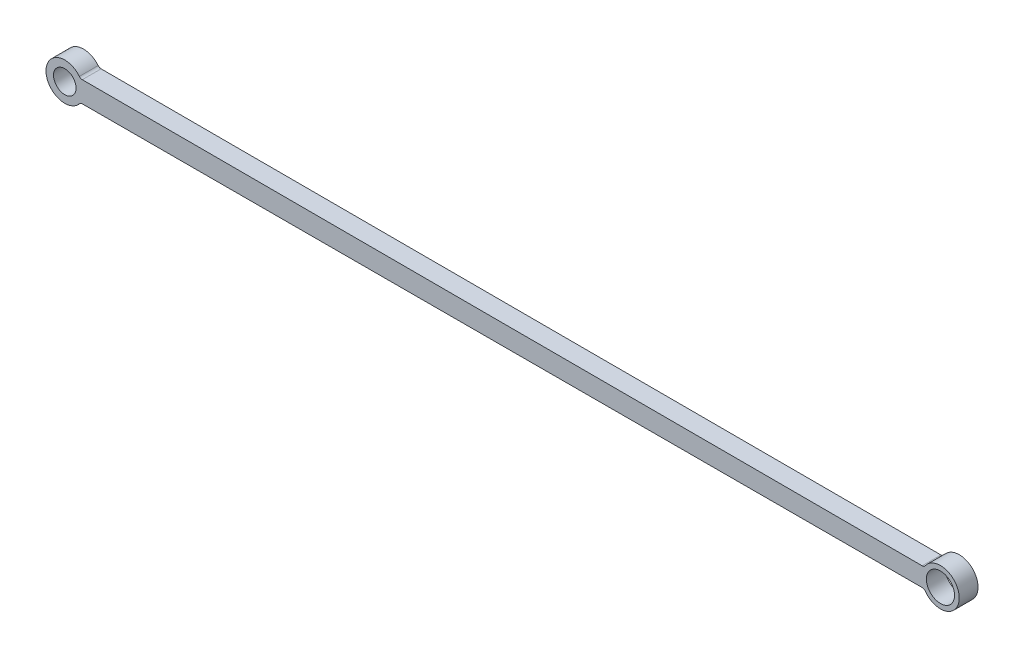
ISO-10303-21;
HEADER;
FILE_DESCRIPTION(('STEP AP214'),'2;1');
FILE_NAME('part.step','',(''),(''),'','','');
FILE_SCHEMA(('AUTOMOTIVE_DESIGN { 1 0 10303 214 1 1 1 1 }'));
ENDSEC;
DATA;
#1=APPLICATION_CONTEXT('core data for automotive mechanical design processes');
#2=APPLICATION_PROTOCOL_DEFINITION('international standard','automotive_design',2000,#1);
#3=PRODUCT_CONTEXT('',#1,'mechanical');
#4=PRODUCT('Part','Part','',(#3));
#5=PRODUCT_RELATED_PRODUCT_CATEGORY('part','',(#4));
#6=PRODUCT_DEFINITION_FORMATION('','',#4);
#7=PRODUCT_DEFINITION_CONTEXT('part definition',#1,'design');
#8=PRODUCT_DEFINITION('design','',#6,#7);
#9=PRODUCT_DEFINITION_SHAPE('','',#8);
#10=(LENGTH_UNIT() NAMED_UNIT(*) SI_UNIT(.MILLI.,.METRE.));
#11=(NAMED_UNIT(*) PLANE_ANGLE_UNIT() SI_UNIT($,.RADIAN.));
#12=(NAMED_UNIT(*) SI_UNIT($,.STERADIAN.) SOLID_ANGLE_UNIT());
#13=UNCERTAINTY_MEASURE_WITH_UNIT(LENGTH_MEASURE(1.E-05),#10,'distance_accuracy_value','');
#14=(GEOMETRIC_REPRESENTATION_CONTEXT(3) GLOBAL_UNCERTAINTY_ASSIGNED_CONTEXT((#13)) GLOBAL_UNIT_ASSIGNED_CONTEXT((#10,
#11,#12)) REPRESENTATION_CONTEXT('',''));
#15=CARTESIAN_POINT('',(0.,0.,0.));
#16=DIRECTION('',(0.,0.,1.));
#17=DIRECTION('',(1.,0.,0.));
#18=AXIS2_PLACEMENT_3D('',#15,#16,#17);
#19=CARTESIAN_POINT('',(4.65604427137213,3.78434297375684,5.));
#20=DIRECTION('',(0.,0.,-1.));
#21=DIRECTION('',(-1.,0.,0.));
#22=AXIS2_PLACEMENT_3D('',#19,#20,#21);
#23=PLANE('',#22);
#24=CARTESIAN_POINT('',(4.65604427137213,3.78434297375684,5.));
#25=DIRECTION('',(0.,0.,-1.));
#26=DIRECTION('',(-1.,0.,0.));
#27=AXIS2_PLACEMENT_3D('',#24,#25,#26);
#28=CIRCLE('',#27,1.);
#29=CARTESIAN_POINT('',(4.65479182801302,2.78434375806433,5.));
#30=VERTEX_POINT('',#29);
#31=CARTESIAN_POINT('',(3.88003689281011,3.15361914479737,5.));
#32=VERTEX_POINT('',#31);
#33=EDGE_CURVE('E144',#30,#32,#28,.T.);
#34=ORIENTED_EDGE('',*,*,#33,.T.);
#35=CARTESIAN_POINT('',(0.,0.,5.));
#36=DIRECTION('',(0.,0.,1.));
#37=DIRECTION('',(1.,0.,0.));
#38=AXIS2_PLACEMENT_3D('',#35,#36,#37);
#39=CIRCLE('',#38,5.);
#40=CARTESIAN_POINT('',(3.88003689281011,-3.15361914479737,5.));
#41=VERTEX_POINT('',#40);
#42=EDGE_CURVE('E92',#32,#41,#39,.T.);
#43=ORIENTED_EDGE('',*,*,#42,.T.);
#44=CARTESIAN_POINT('',(4.65604427137213,-3.78434297375684,5.));
#45=DIRECTION('',(0.,0.,-1.));
#46=DIRECTION('',(1.,0.,0.));
#47=AXIS2_PLACEMENT_3D('',#44,#45,#46);
#48=CIRCLE('',#47,1.);
#49=CARTESIAN_POINT('',(4.65479182801302,-2.78434375806433,5.));
#50=VERTEX_POINT('',#49);
#51=EDGE_CURVE('E159',#41,#50,#48,.T.);
#52=ORIENTED_EDGE('',*,*,#51,.T.);
#53=DIRECTION('',(0.999999215692508,0.00125244335911376,0.));
#54=VECTOR('',#53,1.);
#55=CARTESIAN_POINT('',(4.65479182801302,-2.78434375806433,5.));
#56=LINE('',#55,#54);
#57=CARTESIAN_POINT('',(228.128552645631,-2.50445531087353,5.));
#58=VERTEX_POINT('',#57);
#59=EDGE_CURVE('E172',#50,#58,#56,.T.);
#60=ORIENTED_EDGE('',*,*,#59,.T.);
#61=CARTESIAN_POINT('',(228.12980508899,-3.50445452656603,5.));
#62=DIRECTION('',(0.,0.,-1.));
#63=DIRECTION('',(1.,0.,0.));
#64=AXIS2_PLACEMENT_3D('',#61,#62,#63);
#65=CIRCLE('',#64,0.999999999999995);
#66=CARTESIAN_POINT('',(228.941504240825,-2.92037877213836,5.));
#67=VERTEX_POINT('',#66);
#68=EDGE_CURVE('E111',#58,#67,#65,.T.);
#69=ORIENTED_EDGE('',*,*,#68,.T.);
#70=CARTESIAN_POINT('',(233.,0.,5.));
#71=DIRECTION('',(0.,0.,1.));
#72=DIRECTION('',(1.,0.,0.));
#73=AXIS2_PLACEMENT_3D('',#70,#71,#72);
#74=CIRCLE('',#73,5.00000000000001);
#75=CARTESIAN_POINT('',(228.941504240825,2.92037877213836,5.));
#76=VERTEX_POINT('',#75);
#77=EDGE_CURVE('E105',#67,#76,#74,.T.);
#78=ORIENTED_EDGE('',*,*,#77,.T.);
#79=CARTESIAN_POINT('',(228.12980508899,3.50445452656603,5.));
#80=DIRECTION('',(0.,0.,-1.));
#81=DIRECTION('',(1.,0.,0.));
#82=AXIS2_PLACEMENT_3D('',#79,#80,#81);
#83=CIRCLE('',#82,0.999999999999995);
#84=CARTESIAN_POINT('',(228.128552645631,2.50445531087352,5.));
#85=VERTEX_POINT('',#84);
#86=EDGE_CURVE('E109',#76,#85,#83,.T.);
#87=ORIENTED_EDGE('',*,*,#86,.T.);
#88=DIRECTION('',(-0.999999215692508,0.00125244335911376,0.));
#89=VECTOR('',#88,1.);
#90=CARTESIAN_POINT('',(4.65479182801302,2.78434375806433,5.));
#91=LINE('',#90,#89);
#92=EDGE_CURVE('E49',#85,#30,#91,.T.);
#93=ORIENTED_EDGE('',*,*,#92,.T.);
#94=EDGE_LOOP('',(#34,#43,#52,#60,#69,#78,#87,#93));
#95=FACE_BOUND('',#94,.T.);
#96=CARTESIAN_POINT('',(0.,0.,5.));
#97=DIRECTION('',(0.,0.,1.));
#98=DIRECTION('',(1.,0.,0.));
#99=AXIS2_PLACEMENT_3D('',#96,#97,#98);
#100=CIRCLE('',#99,3.);
#101=CARTESIAN_POINT('',(3.,0.,5.));
#102=VERTEX_POINT('',#101);
#103=EDGE_CURVE('E133',#102,#102,#100,.T.);
#104=ORIENTED_EDGE('',*,*,#103,.F.);
#105=EDGE_LOOP('',(#104));
#106=FACE_BOUND('',#105,.T.);
#107=CARTESIAN_POINT('',(233.,0.,5.));
#108=DIRECTION('',(0.,0.,1.));
#109=DIRECTION('',(1.,0.,0.));
#110=AXIS2_PLACEMENT_3D('',#107,#108,#109);
#111=CIRCLE('',#110,3.75000000000001);
#112=CARTESIAN_POINT('',(236.75,0.,5.));
#113=VERTEX_POINT('',#112);
#114=EDGE_CURVE('E181',#113,#113,#111,.T.);
#115=ORIENTED_EDGE('',*,*,#114,.F.);
#116=EDGE_LOOP('',(#115));
#117=FACE_BOUND('',#116,.T.);
#118=ADVANCED_FACE('F32',(#95,#106,#117),#23,.F.);
#119=CARTESIAN_POINT('',(4.65604427137213,3.78434297375684,0.));
#120=DIRECTION('',(0.,0.,-1.));
#121=DIRECTION('',(-1.,0.,0.));
#122=AXIS2_PLACEMENT_3D('',#119,#120,#121);
#123=PLANE('',#122);
#124=CARTESIAN_POINT('',(0.,0.,0.));
#125=DIRECTION('',(0.,0.,1.));
#126=DIRECTION('',(1.,0.,0.));
#127=AXIS2_PLACEMENT_3D('',#124,#125,#126);
#128=CIRCLE('',#127,3.);
#129=CARTESIAN_POINT('',(3.,0.,0.));
#130=VERTEX_POINT('',#129);
#131=EDGE_CURVE('E178',#130,#130,#128,.T.);
#132=ORIENTED_EDGE('',*,*,#131,.T.);
#133=EDGE_LOOP('',(#132));
#134=FACE_BOUND('',#133,.T.);
#135=CARTESIAN_POINT('',(4.65604427137213,3.78434297375684,0.));
#136=DIRECTION('',(0.,0.,-1.));
#137=DIRECTION('',(-1.,0.,0.));
#138=AXIS2_PLACEMENT_3D('',#135,#136,#137);
#139=CIRCLE('',#138,1.);
#140=CARTESIAN_POINT('',(4.65479182801302,2.78434375806433,0.));
#141=VERTEX_POINT('',#140);
#142=CARTESIAN_POINT('',(3.88003689281011,3.15361914479737,0.));
#143=VERTEX_POINT('',#142);
#144=EDGE_CURVE('E129',#141,#143,#139,.T.);
#145=ORIENTED_EDGE('',*,*,#144,.F.);
#146=DIRECTION('',(-0.999999215692508,0.00125244335911376,0.));
#147=VECTOR('',#146,1.);
#148=CARTESIAN_POINT('',(4.65479182801302,2.78434375806433,0.));
#149=LINE('',#148,#147);
#150=CARTESIAN_POINT('',(228.128552645631,2.50445531087352,0.));
#151=VERTEX_POINT('',#150);
#152=EDGE_CURVE('E84',#151,#141,#149,.T.);
#153=ORIENTED_EDGE('',*,*,#152,.F.);
#154=CARTESIAN_POINT('',(228.12980508899,3.50445452656603,0.));
#155=DIRECTION('',(0.,0.,-1.));
#156=DIRECTION('',(1.,0.,0.));
#157=AXIS2_PLACEMENT_3D('',#154,#155,#156);
#158=CIRCLE('',#157,0.999999999999995);
#159=CARTESIAN_POINT('',(228.941504240825,2.92037877213836,0.));
#160=VERTEX_POINT('',#159);
#161=EDGE_CURVE('E78',#160,#151,#158,.T.);
#162=ORIENTED_EDGE('',*,*,#161,.F.);
#163=CARTESIAN_POINT('',(233.,0.,0.));
#164=DIRECTION('',(0.,0.,1.));
#165=DIRECTION('',(1.,0.,0.));
#166=AXIS2_PLACEMENT_3D('',#163,#164,#165);
#167=CIRCLE('',#166,5.00000000000001);
#168=CARTESIAN_POINT('',(228.941504240825,-2.92037877213836,0.));
#169=VERTEX_POINT('',#168);
#170=EDGE_CURVE('E119',#169,#160,#167,.T.);
#171=ORIENTED_EDGE('',*,*,#170,.F.);
#172=CARTESIAN_POINT('',(228.12980508899,-3.50445452656603,0.));
#173=DIRECTION('',(0.,0.,-1.));
#174=DIRECTION('',(1.,0.,0.));
#175=AXIS2_PLACEMENT_3D('',#172,#173,#174);
#176=CIRCLE('',#175,0.999999999999995);
#177=CARTESIAN_POINT('',(228.128552645631,-2.50445531087353,0.));
#178=VERTEX_POINT('',#177);
#179=EDGE_CURVE('E139',#178,#169,#176,.T.);
#180=ORIENTED_EDGE('',*,*,#179,.F.);
#181=DIRECTION('',(0.999999215692508,0.00125244335911376,0.));
#182=VECTOR('',#181,1.);
#183=CARTESIAN_POINT('',(4.65479182801302,-2.78434375806433,0.));
#184=LINE('',#183,#182);
#185=CARTESIAN_POINT('',(4.65479182801302,-2.78434375806433,0.));
#186=VERTEX_POINT('',#185);
#187=EDGE_CURVE('E137',#186,#178,#184,.T.);
#188=ORIENTED_EDGE('',*,*,#187,.F.);
#189=CARTESIAN_POINT('',(4.65604427137213,-3.78434297375684,0.));
#190=DIRECTION('',(0.,0.,-1.));
#191=DIRECTION('',(1.,0.,0.));
#192=AXIS2_PLACEMENT_3D('',#189,#190,#191);
#193=CIRCLE('',#192,1.);
#194=CARTESIAN_POINT('',(3.88003689281011,-3.15361914479737,0.));
#195=VERTEX_POINT('',#194);
#196=EDGE_CURVE('E135',#195,#186,#193,.T.);
#197=ORIENTED_EDGE('',*,*,#196,.F.);
#198=CARTESIAN_POINT('',(0.,0.,0.));
#199=DIRECTION('',(0.,0.,1.));
#200=DIRECTION('',(1.,0.,0.));
#201=AXIS2_PLACEMENT_3D('',#198,#199,#200);
#202=CIRCLE('',#201,5.);
#203=EDGE_CURVE('E132',#143,#195,#202,.T.);
#204=ORIENTED_EDGE('',*,*,#203,.F.);
#205=EDGE_LOOP('',(#145,#153,#162,#171,#180,#188,#197,#204));
#206=FACE_BOUND('',#205,.T.);
#207=CARTESIAN_POINT('',(233.,0.,0.));
#208=DIRECTION('',(0.,0.,1.));
#209=DIRECTION('',(1.,0.,0.));
#210=AXIS2_PLACEMENT_3D('',#207,#208,#209);
#211=CIRCLE('',#210,3.75000000000001);
#212=CARTESIAN_POINT('',(236.75,0.,0.));
#213=VERTEX_POINT('',#212);
#214=EDGE_CURVE('E184',#213,#213,#211,.T.);
#215=ORIENTED_EDGE('',*,*,#214,.T.);
#216=EDGE_LOOP('',(#215));
#217=FACE_BOUND('',#216,.T.);
#218=ADVANCED_FACE('F163',(#134,#206,#217),#123,.T.);
#219=CARTESIAN_POINT('',(4.65604427137213,3.78434297375684,5.));
#220=DIRECTION('',(0.,0.,-1.));
#221=DIRECTION('',(-1.,0.,0.));
#222=AXIS2_PLACEMENT_3D('',#219,#220,#221);
#223=CYLINDRICAL_SURFACE('',#222,1.);
#224=ORIENTED_EDGE('',*,*,#144,.T.);
#225=DIRECTION('',(0.,0.,-1.));
#226=VECTOR('',#225,1.);
#227=CARTESIAN_POINT('',(3.88003689281011,3.15361914479737,5.));
#228=LINE('',#227,#226);
#229=EDGE_CURVE('E11',#32,#143,#228,.T.);
#230=ORIENTED_EDGE('',*,*,#229,.F.);
#231=ORIENTED_EDGE('',*,*,#33,.F.);
#232=DIRECTION('',(0.,0.,-1.));
#233=VECTOR('',#232,1.);
#234=CARTESIAN_POINT('',(4.65479182801302,2.78434375806433,5.));
#235=LINE('',#234,#233);
#236=EDGE_CURVE('E125',#30,#141,#235,.T.);
#237=ORIENTED_EDGE('',*,*,#236,.T.);
#238=EDGE_LOOP('',(#224,#230,#231,#237));
#239=FACE_BOUND('',#238,.T.);
#240=ADVANCED_FACE('F34',(#239),#223,.F.);
#241=CARTESIAN_POINT('',(0.,0.,5.));
#242=DIRECTION('',(0.,0.,-1.));
#243=DIRECTION('',(-1.,0.,0.));
#244=AXIS2_PLACEMENT_3D('',#241,#242,#243);
#245=CYLINDRICAL_SURFACE('',#244,5.);
#246=ORIENTED_EDGE('',*,*,#203,.T.);
#247=DIRECTION('',(0.,0.,-1.));
#248=VECTOR('',#247,1.);
#249=CARTESIAN_POINT('',(3.88003689281011,-3.15361914479737,5.));
#250=LINE('',#249,#248);
#251=EDGE_CURVE('E41',#41,#195,#250,.T.);
#252=ORIENTED_EDGE('',*,*,#251,.F.);
#253=ORIENTED_EDGE('',*,*,#42,.F.);
#254=ORIENTED_EDGE('',*,*,#229,.T.);
#255=EDGE_LOOP('',(#246,#252,#253,#254));
#256=FACE_BOUND('',#255,.T.);
#257=ADVANCED_FACE('F216',(#256),#245,.T.);
#258=CARTESIAN_POINT('',(4.65604427137213,-3.78434297375684,5.));
#259=DIRECTION('',(0.,0.,-1.));
#260=DIRECTION('',(-1.,0.,0.));
#261=AXIS2_PLACEMENT_3D('',#258,#259,#260);
#262=CYLINDRICAL_SURFACE('',#261,1.);
#263=ORIENTED_EDGE('',*,*,#196,.T.);
#264=DIRECTION('',(0.,0.,-1.));
#265=VECTOR('',#264,1.);
#266=CARTESIAN_POINT('',(4.65479182801302,-2.78434375806433,5.));
#267=LINE('',#266,#265);
#268=EDGE_CURVE('E151',#50,#186,#267,.T.);
#269=ORIENTED_EDGE('',*,*,#268,.F.);
#270=ORIENTED_EDGE('',*,*,#51,.F.);
#271=ORIENTED_EDGE('',*,*,#251,.T.);
#272=EDGE_LOOP('',(#263,#269,#270,#271));
#273=FACE_BOUND('',#272,.T.);
#274=ADVANCED_FACE('F157',(#273),#262,.F.);
#275=CARTESIAN_POINT('',(4.65479182801302,-2.78434375806433,5.));
#276=DIRECTION('',(-0.00125244335911376,0.999999215692508,0.));
#277=DIRECTION('',(-0.999999215692508,-0.00125244335911376,0.));
#278=AXIS2_PLACEMENT_3D('',#275,#276,#277);
#279=PLANE('',#278);
#280=ORIENTED_EDGE('',*,*,#187,.T.);
#281=DIRECTION('',(0.,0.,-1.));
#282=VECTOR('',#281,1.);
#283=CARTESIAN_POINT('',(228.128552645631,-2.50445531087353,5.));
#284=LINE('',#283,#282);
#285=EDGE_CURVE('E148',#58,#178,#284,.T.);
#286=ORIENTED_EDGE('',*,*,#285,.F.);
#287=ORIENTED_EDGE('',*,*,#59,.F.);
#288=ORIENTED_EDGE('',*,*,#268,.T.);
#289=EDGE_LOOP('',(#280,#286,#287,#288));
#290=FACE_BOUND('',#289,.T.);
#291=ADVANCED_FACE('F168',(#290),#279,.F.);
#292=CARTESIAN_POINT('',(228.12980508899,-3.50445452656603,5.));
#293=DIRECTION('',(0.,0.,-1.));
#294=DIRECTION('',(-1.,0.,0.));
#295=AXIS2_PLACEMENT_3D('',#292,#293,#294);
#296=CYLINDRICAL_SURFACE('',#295,0.999999999999995);
#297=ORIENTED_EDGE('',*,*,#179,.T.);
#298=DIRECTION('',(0.,0.,-1.));
#299=VECTOR('',#298,1.);
#300=CARTESIAN_POINT('',(228.941504240825,-2.92037877213836,5.));
#301=LINE('',#300,#299);
#302=EDGE_CURVE('E120',#67,#169,#301,.T.);
#303=ORIENTED_EDGE('',*,*,#302,.F.);
#304=ORIENTED_EDGE('',*,*,#68,.F.);
#305=ORIENTED_EDGE('',*,*,#285,.T.);
#306=EDGE_LOOP('',(#297,#303,#304,#305));
#307=FACE_BOUND('',#306,.T.);
#308=ADVANCED_FACE('F171',(#307),#296,.F.);
#309=CARTESIAN_POINT('',(233.,0.,5.));
#310=DIRECTION('',(0.,0.,-1.));
#311=DIRECTION('',(-1.,0.,0.));
#312=AXIS2_PLACEMENT_3D('',#309,#310,#311);
#313=CYLINDRICAL_SURFACE('',#312,5.00000000000001);
#314=ORIENTED_EDGE('',*,*,#170,.T.);
#315=DIRECTION('',(0.,0.,-1.));
#316=VECTOR('',#315,1.);
#317=CARTESIAN_POINT('',(228.941504240825,2.92037877213836,5.));
#318=LINE('',#317,#316);
#319=EDGE_CURVE('E116',#76,#160,#318,.T.);
#320=ORIENTED_EDGE('',*,*,#319,.F.);
#321=ORIENTED_EDGE('',*,*,#77,.F.);
#322=ORIENTED_EDGE('',*,*,#302,.T.);
#323=EDGE_LOOP('',(#314,#320,#321,#322));
#324=FACE_BOUND('',#323,.T.);
#325=ADVANCED_FACE('F117',(#324),#313,.T.);
#326=CARTESIAN_POINT('',(228.12980508899,3.50445452656603,5.));
#327=DIRECTION('',(0.,0.,-1.));
#328=DIRECTION('',(-1.,0.,0.));
#329=AXIS2_PLACEMENT_3D('',#326,#327,#328);
#330=CYLINDRICAL_SURFACE('',#329,0.999999999999995);
#331=ORIENTED_EDGE('',*,*,#161,.T.);
#332=DIRECTION('',(0.,0.,-1.));
#333=VECTOR('',#332,1.);
#334=CARTESIAN_POINT('',(228.128552645631,2.50445531087352,5.));
#335=LINE('',#334,#333);
#336=EDGE_CURVE('E121',#85,#151,#335,.T.);
#337=ORIENTED_EDGE('',*,*,#336,.F.);
#338=ORIENTED_EDGE('',*,*,#86,.F.);
#339=ORIENTED_EDGE('',*,*,#319,.T.);
#340=EDGE_LOOP('',(#331,#337,#338,#339));
#341=FACE_BOUND('',#340,.T.);
#342=ADVANCED_FACE('F123',(#341),#330,.F.);
#343=CARTESIAN_POINT('',(4.65479182801302,2.78434375806433,5.));
#344=DIRECTION('',(-0.00125244335911376,-0.999999215692508,0.));
#345=DIRECTION('',(0.999999215692508,-0.00125244335911376,0.));
#346=AXIS2_PLACEMENT_3D('',#343,#344,#345);
#347=PLANE('',#346);
#348=ORIENTED_EDGE('',*,*,#152,.T.);
#349=ORIENTED_EDGE('',*,*,#236,.F.);
#350=ORIENTED_EDGE('',*,*,#92,.F.);
#351=ORIENTED_EDGE('',*,*,#336,.T.);
#352=EDGE_LOOP('',(#348,#349,#350,#351));
#353=FACE_BOUND('',#352,.T.);
#354=ADVANCED_FACE('F204',(#353),#347,.F.);
#355=CARTESIAN_POINT('',(0.,0.,5.));
#356=DIRECTION('',(0.,0.,-1.));
#357=DIRECTION('',(-1.,0.,0.));
#358=AXIS2_PLACEMENT_3D('',#355,#356,#357);
#359=CYLINDRICAL_SURFACE('',#358,3.);
#360=ORIENTED_EDGE('',*,*,#103,.T.);
#361=EDGE_LOOP('',(#360));
#362=FACE_BOUND('',#361,.T.);
#363=ORIENTED_EDGE('',*,*,#131,.F.);
#364=EDGE_LOOP('',(#363));
#365=FACE_BOUND('',#364,.T.);
#366=ADVANCED_FACE('F201',(#362,#365),#359,.F.);
#367=CARTESIAN_POINT('',(233.,0.,5.));
#368=DIRECTION('',(0.,0.,-1.));
#369=DIRECTION('',(-1.,0.,0.));
#370=AXIS2_PLACEMENT_3D('',#367,#368,#369);
#371=CYLINDRICAL_SURFACE('',#370,3.75000000000001);
#372=ORIENTED_EDGE('',*,*,#114,.T.);
#373=EDGE_LOOP('',(#372));
#374=FACE_BOUND('',#373,.T.);
#375=ORIENTED_EDGE('',*,*,#214,.F.);
#376=EDGE_LOOP('',(#375));
#377=FACE_BOUND('',#376,.T.);
#378=ADVANCED_FACE('F190',(#374,#377),#371,.F.);
#379=CLOSED_SHELL('',(#118,#218,#240,#257,#274,#291,#308,#325,#342,#354,#366,#378));
#380=MANIFOLD_SOLID_BREP('B2',#379);
#381=ADVANCED_BREP_SHAPE_REPRESENTATION('',(#18,#380),#14);
#382=SHAPE_DEFINITION_REPRESENTATION(#9,#381);
ENDSEC;
END-ISO-10303-21;
